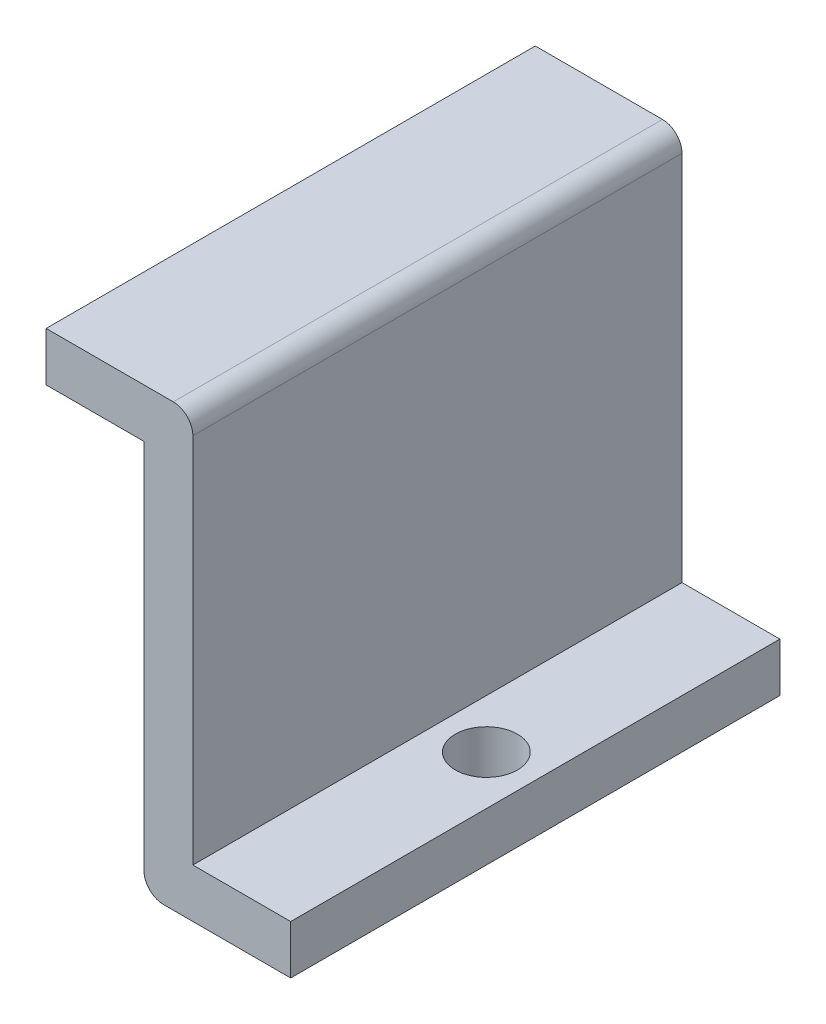
ISO-10303-21;
HEADER;
FILE_DESCRIPTION(('STEP AP214'),'2;1');
FILE_NAME('part.step','',(''),(''),'','','');
FILE_SCHEMA(('AUTOMOTIVE_DESIGN { 1 0 10303 214 1 1 1 1 }'));
ENDSEC;
DATA;
#1=APPLICATION_CONTEXT('core data for automotive mechanical design processes');
#2=APPLICATION_PROTOCOL_DEFINITION('international standard','automotive_design',2000,#1);
#3=PRODUCT_CONTEXT('',#1,'mechanical');
#4=PRODUCT('Part','Part','',(#3));
#5=PRODUCT_RELATED_PRODUCT_CATEGORY('part','',(#4));
#6=PRODUCT_DEFINITION_FORMATION('','',#4);
#7=PRODUCT_DEFINITION_CONTEXT('part definition',#1,'design');
#8=PRODUCT_DEFINITION('design','',#6,#7);
#9=PRODUCT_DEFINITION_SHAPE('','',#8);
#10=(LENGTH_UNIT() NAMED_UNIT(*) SI_UNIT(.MILLI.,.METRE.));
#11=(NAMED_UNIT(*) PLANE_ANGLE_UNIT() SI_UNIT($,.RADIAN.));
#12=(NAMED_UNIT(*) SI_UNIT($,.STERADIAN.) SOLID_ANGLE_UNIT());
#13=UNCERTAINTY_MEASURE_WITH_UNIT(LENGTH_MEASURE(1.E-05),#10,'distance_accuracy_value','');
#14=(GEOMETRIC_REPRESENTATION_CONTEXT(3) GLOBAL_UNCERTAINTY_ASSIGNED_CONTEXT((#13)) GLOBAL_UNIT_ASSIGNED_CONTEXT((#10,
#11,#12)) REPRESENTATION_CONTEXT('',''));
#15=CARTESIAN_POINT('',(0.,0.,0.));
#16=DIRECTION('',(0.,0.,1.));
#17=DIRECTION('',(1.,0.,0.));
#18=AXIS2_PLACEMENT_3D('',#15,#16,#17);
#19=CARTESIAN_POINT('',(0.,18.,50.));
#20=DIRECTION('',(-1.,0.,0.));
#21=DIRECTION('',(0.,-1.,0.));
#22=AXIS2_PLACEMENT_3D('',#19,#20,#21);
#23=PLANE('',#22);
#24=DIRECTION('',(0.,1.,0.));
#25=VECTOR('',#24,1.);
#26=CARTESIAN_POINT('',(0.,18.,0.));
#27=LINE('',#26,#25);
#28=CARTESIAN_POINT('',(0.,-20.,0.));
#29=VERTEX_POINT('',#28);
#30=CARTESIAN_POINT('',(0.,18.,0.));
#31=VERTEX_POINT('',#30);
#32=EDGE_CURVE('E98',#29,#31,#27,.T.);
#33=ORIENTED_EDGE('',*,*,#32,.T.);
#34=DIRECTION('',(0.,0.,-1.));
#35=VECTOR('',#34,1.);
#36=CARTESIAN_POINT('',(0.,18.,50.));
#37=LINE('',#36,#35);
#38=CARTESIAN_POINT('',(0.,18.,50.));
#39=VERTEX_POINT('',#38);
#40=EDGE_CURVE('E11',#39,#31,#37,.T.);
#41=ORIENTED_EDGE('',*,*,#40,.F.);
#42=DIRECTION('',(0.,1.,0.));
#43=VECTOR('',#42,1.);
#44=CARTESIAN_POINT('',(0.,-20.,50.));
#45=LINE('',#44,#43);
#46=CARTESIAN_POINT('',(0.,-20.,50.));
#47=VERTEX_POINT('',#46);
#48=EDGE_CURVE('E104',#47,#39,#45,.T.);
#49=ORIENTED_EDGE('',*,*,#48,.F.);
#50=DIRECTION('',(0.,0.,-1.));
#51=VECTOR('',#50,1.);
#52=CARTESIAN_POINT('',(0.,-20.,50.));
#53=LINE('',#52,#51);
#54=EDGE_CURVE('E148',#47,#29,#53,.T.);
#55=ORIENTED_EDGE('',*,*,#54,.T.);
#56=EDGE_LOOP('',(#33,#41,#49,#55));
#57=FACE_BOUND('',#56,.T.);
#58=ADVANCED_FACE('F39',(#57),#23,.F.);
#59=CARTESIAN_POINT('',(-2.,18.,50.));
#60=DIRECTION('',(0.,0.,-1.));
#61=DIRECTION('',(-1.,0.,0.));
#62=AXIS2_PLACEMENT_3D('',#59,#60,#61);
#63=CYLINDRICAL_SURFACE('',#62,2.);
#64=CARTESIAN_POINT('',(-2.,18.,0.));
#65=DIRECTION('',(0.,0.,1.));
#66=DIRECTION('',(-1.,0.,0.));
#67=AXIS2_PLACEMENT_3D('',#64,#65,#66);
#68=CIRCLE('',#67,2.);
#69=CARTESIAN_POINT('',(-2.00000000000002,20.,0.));
#70=VERTEX_POINT('',#69);
#71=EDGE_CURVE('E154',#31,#70,#68,.T.);
#72=ORIENTED_EDGE('',*,*,#71,.T.);
#73=DIRECTION('',(0.,0.,-1.));
#74=VECTOR('',#73,1.);
#75=CARTESIAN_POINT('',(-2.00000000000002,20.,50.));
#76=LINE('',#75,#74);
#77=CARTESIAN_POINT('',(-2.00000000000002,20.,50.));
#78=VERTEX_POINT('',#77);
#79=EDGE_CURVE('E48',#78,#70,#76,.T.);
#80=ORIENTED_EDGE('',*,*,#79,.F.);
#81=CARTESIAN_POINT('',(-2.,18.,50.));
#82=DIRECTION('',(0.,0.,1.));
#83=DIRECTION('',(-1.,0.,0.));
#84=AXIS2_PLACEMENT_3D('',#81,#82,#83);
#85=CIRCLE('',#84,2.);
#86=EDGE_CURVE('E215',#39,#78,#85,.T.);
#87=ORIENTED_EDGE('',*,*,#86,.F.);
#88=ORIENTED_EDGE('',*,*,#40,.T.);
#89=EDGE_LOOP('',(#72,#80,#87,#88));
#90=FACE_BOUND('',#89,.T.);
#91=ADVANCED_FACE('F214',(#90),#63,.T.);
#92=CARTESIAN_POINT('',(-8.50000000000001,20.,50.));
#93=DIRECTION('',(0.,-1.,0.));
#94=DIRECTION('',(1.,0.,0.));
#95=AXIS2_PLACEMENT_3D('',#92,#93,#94);
#96=PLANE('',#95);
#97=DIRECTION('',(-1.,0.,0.));
#98=VECTOR('',#97,1.);
#99=CARTESIAN_POINT('',(-8.50000000000001,20.,0.));
#100=LINE('',#99,#98);
#101=CARTESIAN_POINT('',(-15.,20.,0.));
#102=VERTEX_POINT('',#101);
#103=EDGE_CURVE('E159',#70,#102,#100,.T.);
#104=ORIENTED_EDGE('',*,*,#103,.T.);
#105=DIRECTION('',(0.,0.,-1.));
#106=VECTOR('',#105,1.);
#107=CARTESIAN_POINT('',(-15.,20.,50.));
#108=LINE('',#107,#106);
#109=CARTESIAN_POINT('',(-15.,20.,50.));
#110=VERTEX_POINT('',#109);
#111=EDGE_CURVE('E201',#110,#102,#108,.T.);
#112=ORIENTED_EDGE('',*,*,#111,.F.);
#113=DIRECTION('',(-1.,0.,0.));
#114=VECTOR('',#113,1.);
#115=CARTESIAN_POINT('',(-8.50000000000001,20.,50.));
#116=LINE('',#115,#114);
#117=EDGE_CURVE('E211',#78,#110,#116,.T.);
#118=ORIENTED_EDGE('',*,*,#117,.F.);
#119=ORIENTED_EDGE('',*,*,#79,.T.);
#120=EDGE_LOOP('',(#104,#112,#118,#119));
#121=FACE_BOUND('',#120,.T.);
#122=ADVANCED_FACE('F209',(#121),#96,.F.);
#123=CARTESIAN_POINT('',(-15.,20.,50.));
#124=DIRECTION('',(1.,0.,0.));
#125=DIRECTION('',(0.,1.,0.));
#126=AXIS2_PLACEMENT_3D('',#123,#124,#125);
#127=PLANE('',#126);
#128=DIRECTION('',(0.,-1.,0.));
#129=VECTOR('',#128,1.);
#130=CARTESIAN_POINT('',(-15.,20.,0.));
#131=LINE('',#130,#129);
#132=CARTESIAN_POINT('',(-15.,15.,0.));
#133=VERTEX_POINT('',#132);
#134=EDGE_CURVE('E162',#102,#133,#131,.T.);
#135=ORIENTED_EDGE('',*,*,#134,.T.);
#136=DIRECTION('',(0.,0.,-1.));
#137=VECTOR('',#136,1.);
#138=CARTESIAN_POINT('',(-15.,15.,50.));
#139=LINE('',#138,#137);
#140=CARTESIAN_POINT('',(-15.,15.,50.));
#141=VERTEX_POINT('',#140);
#142=EDGE_CURVE('E197',#141,#133,#139,.T.);
#143=ORIENTED_EDGE('',*,*,#142,.F.);
#144=DIRECTION('',(0.,-1.,0.));
#145=VECTOR('',#144,1.);
#146=CARTESIAN_POINT('',(-15.,20.,50.));
#147=LINE('',#146,#145);
#148=EDGE_CURVE('E231',#110,#141,#147,.T.);
#149=ORIENTED_EDGE('',*,*,#148,.F.);
#150=ORIENTED_EDGE('',*,*,#111,.T.);
#151=EDGE_LOOP('',(#135,#143,#149,#150));
#152=FACE_BOUND('',#151,.T.);
#153=ADVANCED_FACE('F221',(#152),#127,.F.);
#154=CARTESIAN_POINT('',(-5.,15.,50.));
#155=DIRECTION('',(0.,1.,0.));
#156=DIRECTION('',(-1.,0.,0.));
#157=AXIS2_PLACEMENT_3D('',#154,#155,#156);
#158=PLANE('',#157);
#159=DIRECTION('',(1.,0.,0.));
#160=VECTOR('',#159,1.);
#161=CARTESIAN_POINT('',(-5.,15.,0.));
#162=LINE('',#161,#160);
#163=CARTESIAN_POINT('',(-5.,15.,0.));
#164=VERTEX_POINT('',#163);
#165=EDGE_CURVE('E165',#133,#164,#162,.T.);
#166=ORIENTED_EDGE('',*,*,#165,.T.);
#167=DIRECTION('',(0.,0.,-1.));
#168=VECTOR('',#167,1.);
#169=CARTESIAN_POINT('',(-5.,15.,50.));
#170=LINE('',#169,#168);
#171=CARTESIAN_POINT('',(-5.,15.,50.));
#172=VERTEX_POINT('',#171);
#173=EDGE_CURVE('E193',#172,#164,#170,.T.);
#174=ORIENTED_EDGE('',*,*,#173,.F.);
#175=DIRECTION('',(1.,0.,0.));
#176=VECTOR('',#175,1.);
#177=CARTESIAN_POINT('',(-5.,15.,50.));
#178=LINE('',#177,#176);
#179=EDGE_CURVE('E227',#141,#172,#178,.T.);
#180=ORIENTED_EDGE('',*,*,#179,.F.);
#181=ORIENTED_EDGE('',*,*,#142,.T.);
#182=EDGE_LOOP('',(#166,#174,#180,#181));
#183=FACE_BOUND('',#182,.T.);
#184=ADVANCED_FACE('F225',(#183),#158,.F.);
#185=CARTESIAN_POINT('',(-5.,0.,50.));
#186=DIRECTION('',(1.,0.,0.));
#187=DIRECTION('',(0.,1.,0.));
#188=AXIS2_PLACEMENT_3D('',#185,#186,#187);
#189=PLANE('',#188);
#190=DIRECTION('',(0.,-1.,0.));
#191=VECTOR('',#190,1.);
#192=CARTESIAN_POINT('',(-5.,0.,0.));
#193=LINE('',#192,#191);
#194=CARTESIAN_POINT('',(-5.,-23.,0.));
#195=VERTEX_POINT('',#194);
#196=EDGE_CURVE('E169',#164,#195,#193,.T.);
#197=ORIENTED_EDGE('',*,*,#196,.T.);
#198=DIRECTION('',(0.,0.,-1.));
#199=VECTOR('',#198,1.);
#200=CARTESIAN_POINT('',(-5.,-23.,50.));
#201=LINE('',#200,#199);
#202=CARTESIAN_POINT('',(-5.,-23.,50.));
#203=VERTEX_POINT('',#202);
#204=EDGE_CURVE('E189',#203,#195,#201,.T.);
#205=ORIENTED_EDGE('',*,*,#204,.F.);
#206=DIRECTION('',(0.,-1.,0.));
#207=VECTOR('',#206,1.);
#208=CARTESIAN_POINT('',(-5.,0.,50.));
#209=LINE('',#208,#207);
#210=EDGE_CURVE('E230',#172,#203,#209,.T.);
#211=ORIENTED_EDGE('',*,*,#210,.F.);
#212=ORIENTED_EDGE('',*,*,#173,.T.);
#213=EDGE_LOOP('',(#197,#205,#211,#212));
#214=FACE_BOUND('',#213,.T.);
#215=ADVANCED_FACE('F265',(#214),#189,.F.);
#216=CARTESIAN_POINT('',(-3.,-23.,50.));
#217=DIRECTION('',(0.,0.,-1.));
#218=DIRECTION('',(-1.,0.,0.));
#219=AXIS2_PLACEMENT_3D('',#216,#217,#218);
#220=CYLINDRICAL_SURFACE('',#219,2.);
#221=CARTESIAN_POINT('',(-3.,-23.,0.));
#222=DIRECTION('',(0.,0.,1.));
#223=DIRECTION('',(1.,0.,0.));
#224=AXIS2_PLACEMENT_3D('',#221,#222,#223);
#225=CIRCLE('',#224,2.);
#226=CARTESIAN_POINT('',(-2.99999999999998,-25.,0.));
#227=VERTEX_POINT('',#226);
#228=EDGE_CURVE('E172',#195,#227,#225,.T.);
#229=ORIENTED_EDGE('',*,*,#228,.T.);
#230=DIRECTION('',(0.,0.,-1.));
#231=VECTOR('',#230,1.);
#232=CARTESIAN_POINT('',(-2.99999999999998,-25.,50.));
#233=LINE('',#232,#231);
#234=CARTESIAN_POINT('',(-2.99999999999998,-25.,50.));
#235=VERTEX_POINT('',#234);
#236=EDGE_CURVE('E141',#235,#227,#233,.T.);
#237=ORIENTED_EDGE('',*,*,#236,.F.);
#238=CARTESIAN_POINT('',(-3.,-23.,50.));
#239=DIRECTION('',(0.,0.,1.));
#240=DIRECTION('',(1.,0.,0.));
#241=AXIS2_PLACEMENT_3D('',#238,#239,#240);
#242=CIRCLE('',#241,2.);
#243=EDGE_CURVE('E130',#203,#235,#242,.T.);
#244=ORIENTED_EDGE('',*,*,#243,.F.);
#245=ORIENTED_EDGE('',*,*,#204,.T.);
#246=EDGE_LOOP('',(#229,#237,#244,#245));
#247=FACE_BOUND('',#246,.T.);
#248=ADVANCED_FACE('F257',(#247),#220,.T.);
#249=CARTESIAN_POINT('',(-2.99999999999998,-25.,50.));
#250=DIRECTION('',(0.,1.,0.));
#251=DIRECTION('',(0.,0.,1.));
#252=AXIS2_PLACEMENT_3D('',#249,#250,#251);
#253=PLANE('',#252);
#254=CARTESIAN_POINT('',(5.,-25.,25.));
#255=DIRECTION('',(0.,-1.,0.));
#256=DIRECTION('',(0.,0.,-1.));
#257=AXIS2_PLACEMENT_3D('',#254,#255,#256);
#258=CIRCLE('',#257,3.175);
#259=CARTESIAN_POINT('',(5.,-25.,21.825));
#260=VERTEX_POINT('',#259);
#261=EDGE_CURVE('E248',#260,#260,#258,.T.);
#262=ORIENTED_EDGE('',*,*,#261,.F.);
#263=EDGE_LOOP('',(#262));
#264=FACE_BOUND('',#263,.T.);
#265=DIRECTION('',(1.,0.,0.));
#266=VECTOR('',#265,1.);
#267=CARTESIAN_POINT('',(-2.99999999999998,-25.,0.));
#268=LINE('',#267,#266);
#269=CARTESIAN_POINT('',(10.,-25.,0.));
#270=VERTEX_POINT('',#269);
#271=EDGE_CURVE('E139',#227,#270,#268,.T.);
#272=ORIENTED_EDGE('',*,*,#271,.T.);
#273=DIRECTION('',(0.,0.,-1.));
#274=VECTOR('',#273,1.);
#275=CARTESIAN_POINT('',(10.,-25.,50.));
#276=LINE('',#275,#274);
#277=CARTESIAN_POINT('',(10.,-25.,50.));
#278=VERTEX_POINT('',#277);
#279=EDGE_CURVE('E136',#278,#270,#276,.T.);
#280=ORIENTED_EDGE('',*,*,#279,.F.);
#281=DIRECTION('',(1.,0.,0.));
#282=VECTOR('',#281,1.);
#283=CARTESIAN_POINT('',(-2.99999999999998,-25.,50.));
#284=LINE('',#283,#282);
#285=EDGE_CURVE('E124',#235,#278,#284,.T.);
#286=ORIENTED_EDGE('',*,*,#285,.F.);
#287=ORIENTED_EDGE('',*,*,#236,.T.);
#288=EDGE_LOOP('',(#272,#280,#286,#287));
#289=FACE_BOUND('',#288,.T.);
#290=ADVANCED_FACE('F137',(#264,#289),#253,.F.);
#291=CARTESIAN_POINT('',(10.,-25.,50.));
#292=DIRECTION('',(-1.,0.,0.));
#293=DIRECTION('',(0.,0.,1.));
#294=AXIS2_PLACEMENT_3D('',#291,#292,#293);
#295=PLANE('',#294);
#296=DIRECTION('',(0.,1.,0.));
#297=VECTOR('',#296,1.);
#298=CARTESIAN_POINT('',(10.,-25.,0.));
#299=LINE('',#298,#297);
#300=CARTESIAN_POINT('',(10.,-20.,0.));
#301=VERTEX_POINT('',#300);
#302=EDGE_CURVE('E91',#270,#301,#299,.T.);
#303=ORIENTED_EDGE('',*,*,#302,.T.);
#304=DIRECTION('',(0.,0.,-1.));
#305=VECTOR('',#304,1.);
#306=CARTESIAN_POINT('',(10.,-20.,50.));
#307=LINE('',#306,#305);
#308=CARTESIAN_POINT('',(10.,-20.,50.));
#309=VERTEX_POINT('',#308);
#310=EDGE_CURVE('E142',#309,#301,#307,.T.);
#311=ORIENTED_EDGE('',*,*,#310,.F.);
#312=DIRECTION('',(0.,1.,0.));
#313=VECTOR('',#312,1.);
#314=CARTESIAN_POINT('',(10.,-25.,50.));
#315=LINE('',#314,#313);
#316=EDGE_CURVE('E128',#278,#309,#315,.T.);
#317=ORIENTED_EDGE('',*,*,#316,.F.);
#318=ORIENTED_EDGE('',*,*,#279,.T.);
#319=EDGE_LOOP('',(#303,#311,#317,#318));
#320=FACE_BOUND('',#319,.T.);
#321=ADVANCED_FACE('F144',(#320),#295,.F.);
#322=CARTESIAN_POINT('',(10.,-20.,50.));
#323=DIRECTION('',(0.,-1.,0.));
#324=DIRECTION('',(1.,0.,0.));
#325=AXIS2_PLACEMENT_3D('',#322,#323,#324);
#326=PLANE('',#325);
#327=CARTESIAN_POINT('',(5.,-20.,25.));
#328=DIRECTION('',(0.,-1.,0.));
#329=DIRECTION('',(1.,0.,0.));
#330=AXIS2_PLACEMENT_3D('',#327,#328,#329);
#331=CIRCLE('',#330,3.175);
#332=CARTESIAN_POINT('',(8.175,-20.,25.));
#333=VERTEX_POINT('',#332);
#334=EDGE_CURVE('E155',#333,#333,#331,.F.);
#335=ORIENTED_EDGE('',*,*,#334,.F.);
#336=EDGE_LOOP('',(#335));
#337=FACE_BOUND('',#336,.T.);
#338=DIRECTION('',(-1.,0.,0.));
#339=VECTOR('',#338,1.);
#340=CARTESIAN_POINT('',(10.,-20.,0.));
#341=LINE('',#340,#339);
#342=EDGE_CURVE('E179',#301,#29,#341,.T.);
#343=ORIENTED_EDGE('',*,*,#342,.T.);
#344=ORIENTED_EDGE('',*,*,#54,.F.);
#345=DIRECTION('',(-1.,0.,0.));
#346=VECTOR('',#345,1.);
#347=CARTESIAN_POINT('',(10.,-20.,50.));
#348=LINE('',#347,#346);
#349=EDGE_CURVE('E56',#309,#47,#348,.T.);
#350=ORIENTED_EDGE('',*,*,#349,.F.);
#351=ORIENTED_EDGE('',*,*,#310,.T.);
#352=EDGE_LOOP('',(#343,#344,#350,#351));
#353=FACE_BOUND('',#352,.T.);
#354=ADVANCED_FACE('F263',(#337,#353),#326,.F.);
#355=CARTESIAN_POINT('',(-2.,18.,50.));
#356=DIRECTION('',(0.,0.,-1.));
#357=DIRECTION('',(-1.,0.,0.));
#358=AXIS2_PLACEMENT_3D('',#355,#356,#357);
#359=PLANE('',#358);
#360=ORIENTED_EDGE('',*,*,#48,.T.);
#361=ORIENTED_EDGE('',*,*,#86,.T.);
#362=ORIENTED_EDGE('',*,*,#117,.T.);
#363=ORIENTED_EDGE('',*,*,#148,.T.);
#364=ORIENTED_EDGE('',*,*,#179,.T.);
#365=ORIENTED_EDGE('',*,*,#210,.T.);
#366=ORIENTED_EDGE('',*,*,#243,.T.);
#367=ORIENTED_EDGE('',*,*,#285,.T.);
#368=ORIENTED_EDGE('',*,*,#316,.T.);
#369=ORIENTED_EDGE('',*,*,#349,.T.);
#370=EDGE_LOOP('',(#360,#361,#362,#363,#364,#365,#366,#367,#368,#369));
#371=FACE_BOUND('',#370,.T.);
#372=ADVANCED_FACE('F126',(#371),#359,.F.);
#373=CARTESIAN_POINT('',(-2.,18.,0.));
#374=DIRECTION('',(0.,0.,-1.));
#375=DIRECTION('',(-1.,0.,0.));
#376=AXIS2_PLACEMENT_3D('',#373,#374,#375);
#377=PLANE('',#376);
#378=ORIENTED_EDGE('',*,*,#32,.F.);
#379=ORIENTED_EDGE('',*,*,#342,.F.);
#380=ORIENTED_EDGE('',*,*,#302,.F.);
#381=ORIENTED_EDGE('',*,*,#271,.F.);
#382=ORIENTED_EDGE('',*,*,#228,.F.);
#383=ORIENTED_EDGE('',*,*,#196,.F.);
#384=ORIENTED_EDGE('',*,*,#165,.F.);
#385=ORIENTED_EDGE('',*,*,#134,.F.);
#386=ORIENTED_EDGE('',*,*,#103,.F.);
#387=ORIENTED_EDGE('',*,*,#71,.F.);
#388=EDGE_LOOP('',(#378,#379,#380,#381,#382,#383,#384,#385,#386,#387));
#389=FACE_BOUND('',#388,.T.);
#390=ADVANCED_FACE('F216',(#389),#377,.T.);
#391=CARTESIAN_POINT('',(5.,20.001,25.));
#392=DIRECTION('',(0.,-1.,0.));
#393=DIRECTION('',(0.,0.,-1.));
#394=AXIS2_PLACEMENT_3D('',#391,#392,#393);
#395=CYLINDRICAL_SURFACE('',#394,3.175);
#396=ORIENTED_EDGE('',*,*,#261,.T.);
#397=EDGE_LOOP('',(#396));
#398=FACE_BOUND('',#397,.T.);
#399=ORIENTED_EDGE('',*,*,#334,.T.);
#400=EDGE_LOOP('',(#399));
#401=FACE_BOUND('',#400,.T.);
#402=ADVANCED_FACE('F253',(#398,#401),#395,.F.);
#403=CLOSED_SHELL('',(#58,#91,#122,#153,#184,#215,#248,#290,#321,#354,#372,#390,#402));
#404=MANIFOLD_SOLID_BREP('B2',#403);
#405=ADVANCED_BREP_SHAPE_REPRESENTATION('',(#18,#404),#14);
#406=SHAPE_DEFINITION_REPRESENTATION(#9,#405);
ENDSEC;
END-ISO-10303-21;
